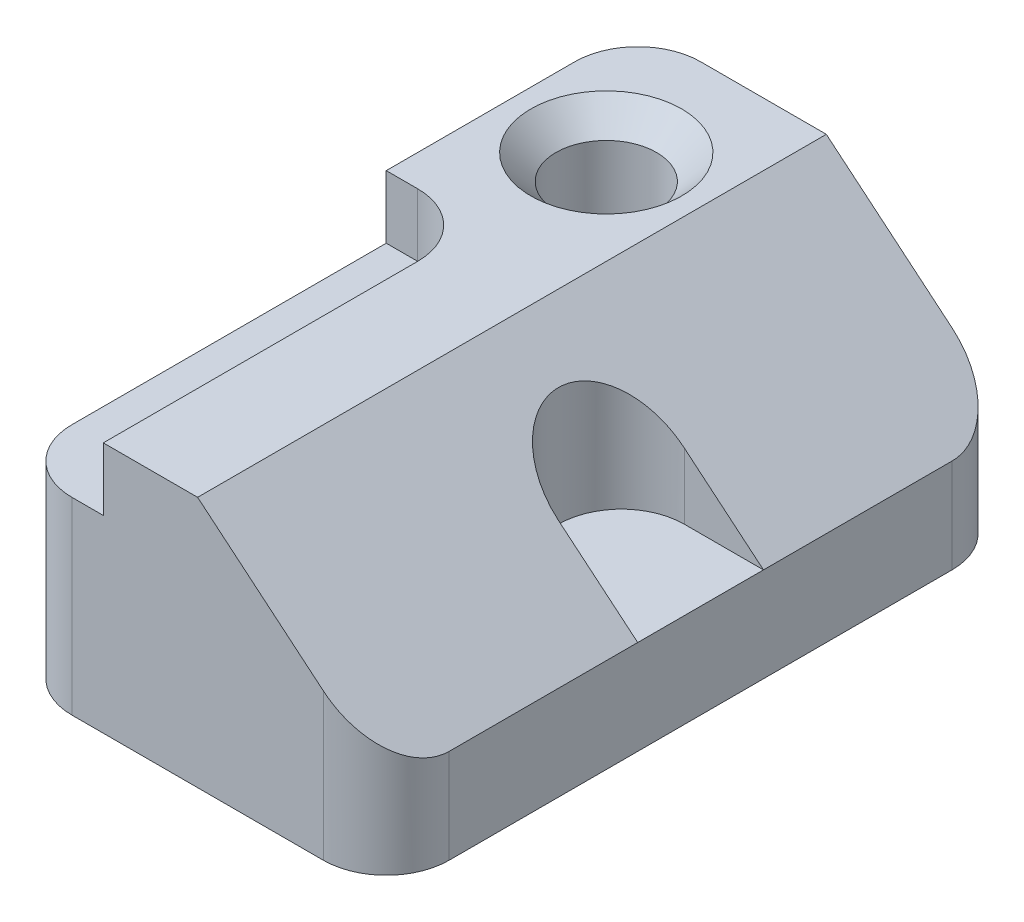
ISO-10303-21;
HEADER;
FILE_DESCRIPTION(('STEP AP214'),'2;1');
FILE_NAME('part.step','',(''),(''),'','','');
FILE_SCHEMA(('AUTOMOTIVE_DESIGN { 1 0 10303 214 1 1 1 1 }'));
ENDSEC;
DATA;
#1=APPLICATION_CONTEXT('core data for automotive mechanical design processes');
#2=APPLICATION_PROTOCOL_DEFINITION('international standard','automotive_design',2000,#1);
#3=PRODUCT_CONTEXT('',#1,'mechanical');
#4=PRODUCT('Part','Part','',(#3));
#5=PRODUCT_RELATED_PRODUCT_CATEGORY('part','',(#4));
#6=PRODUCT_DEFINITION_FORMATION('','',#4);
#7=PRODUCT_DEFINITION_CONTEXT('part definition',#1,'design');
#8=PRODUCT_DEFINITION('design','',#6,#7);
#9=PRODUCT_DEFINITION_SHAPE('','',#8);
#10=(LENGTH_UNIT() NAMED_UNIT(*) SI_UNIT(.MILLI.,.METRE.));
#11=(NAMED_UNIT(*) PLANE_ANGLE_UNIT() SI_UNIT($,.RADIAN.));
#12=(NAMED_UNIT(*) SI_UNIT($,.STERADIAN.) SOLID_ANGLE_UNIT());
#13=UNCERTAINTY_MEASURE_WITH_UNIT(LENGTH_MEASURE(1.E-05),#10,'distance_accuracy_value','');
#14=(GEOMETRIC_REPRESENTATION_CONTEXT(3) GLOBAL_UNCERTAINTY_ASSIGNED_CONTEXT((#13)) GLOBAL_UNIT_ASSIGNED_CONTEXT((#10,
#11,#12)) REPRESENTATION_CONTEXT('',''));
#15=CARTESIAN_POINT('',(0.,0.,0.));
#16=DIRECTION('',(0.,0.,1.));
#17=DIRECTION('',(1.,0.,0.));
#18=AXIS2_PLACEMENT_3D('',#15,#16,#17);
#19=CARTESIAN_POINT('',(0.,50.8,127.));
#20=DIRECTION('',(0.,-1.,0.));
#21=DIRECTION('',(0.,0.,-1.));
#22=AXIS2_PLACEMENT_3D('',#19,#20,#21);
#23=PLANE('',#22);
#24=CARTESIAN_POINT('',(19.0444511670513,50.8,25.4));
#25=DIRECTION('',(0.,-1.,0.));
#26=DIRECTION('',(0.,0.,-1.));
#27=AXIS2_PLACEMENT_3D('',#24,#25,#26);
#28=CIRCLE('',#27,15.24);
#29=CARTESIAN_POINT('',(19.0444511670513,50.8,10.16));
#30=VERTEX_POINT('',#29);
#31=EDGE_CURVE('E231',#30,#30,#28,.T.);
#32=ORIENTED_EDGE('',*,*,#31,.T.);
#33=EDGE_LOOP('',(#32));
#34=FACE_BOUND('',#33,.T.);
#35=DIRECTION('',(-1.,0.,0.));
#36=VECTOR('',#35,1.);
#37=CARTESIAN_POINT('',(0.,50.8,0.));
#38=LINE('',#37,#36);
#39=CARTESIAN_POINT('',(38.1,50.8,0.));
#40=VERTEX_POINT('',#39);
#41=CARTESIAN_POINT('',(12.7,50.8,0.));
#42=VERTEX_POINT('',#41);
#43=EDGE_CURVE('E199',#40,#42,#38,.T.);
#44=ORIENTED_EDGE('',*,*,#43,.T.);
#45=CARTESIAN_POINT('',(12.7,50.8,12.7));
#46=DIRECTION('',(0.,-1.,0.));
#47=DIRECTION('',(0.,0.,-1.));
#48=AXIS2_PLACEMENT_3D('',#45,#46,#47);
#49=CIRCLE('',#48,12.7);
#50=CARTESIAN_POINT('',(0.,50.8,12.7));
#51=VERTEX_POINT('',#50);
#52=EDGE_CURVE('E56',#42,#51,#49,.F.);
#53=ORIENTED_EDGE('',*,*,#52,.T.);
#54=DIRECTION('',(0.,0.,-1.));
#55=VECTOR('',#54,1.);
#56=CARTESIAN_POINT('',(0.,50.8,127.));
#57=LINE('',#56,#55);
#58=CARTESIAN_POINT('',(0.,50.8,50.8));
#59=VERTEX_POINT('',#58);
#60=EDGE_CURVE('E226',#59,#51,#57,.T.);
#61=ORIENTED_EDGE('',*,*,#60,.F.);
#62=DIRECTION('',(-1.,0.,0.));
#63=VECTOR('',#62,1.);
#64=CARTESIAN_POINT('',(0.,50.8,50.8));
#65=LINE('',#64,#63);
#66=CARTESIAN_POINT('',(6.35,50.8,50.8));
#67=VERTEX_POINT('',#66);
#68=EDGE_CURVE('E181',#67,#59,#65,.T.);
#69=ORIENTED_EDGE('',*,*,#68,.F.);
#70=CARTESIAN_POINT('',(6.35,50.8,63.5));
#71=DIRECTION('',(0.,-1.,0.));
#72=DIRECTION('',(0.,0.,-1.));
#73=AXIS2_PLACEMENT_3D('',#70,#71,#72);
#74=CIRCLE('',#73,12.7);
#75=CARTESIAN_POINT('',(19.05,50.8,63.5000000000001));
#76=VERTEX_POINT('',#75);
#77=EDGE_CURVE('E241',#67,#76,#74,.T.);
#78=ORIENTED_EDGE('',*,*,#77,.T.);
#79=DIRECTION('',(0.,0.,-1.));
#80=VECTOR('',#79,1.);
#81=CARTESIAN_POINT('',(19.05,50.8,127.));
#82=LINE('',#81,#80);
#83=CARTESIAN_POINT('',(19.05,50.8,127.));
#84=VERTEX_POINT('',#83);
#85=EDGE_CURVE('E176',#84,#76,#82,.T.);
#86=ORIENTED_EDGE('',*,*,#85,.F.);
#87=DIRECTION('',(-1.,0.,0.));
#88=VECTOR('',#87,1.);
#89=CARTESIAN_POINT('',(0.,50.8,127.));
#90=LINE('',#89,#88);
#91=CARTESIAN_POINT('',(38.1,50.8,127.));
#92=VERTEX_POINT('',#91);
#93=EDGE_CURVE('E200',#92,#84,#90,.T.);
#94=ORIENTED_EDGE('',*,*,#93,.F.);
#95=DIRECTION('',(0.,0.,-1.));
#96=VECTOR('',#95,1.);
#97=CARTESIAN_POINT('',(38.1,50.8,127.));
#98=LINE('',#97,#96);
#99=EDGE_CURVE('E209',#92,#40,#98,.T.);
#100=ORIENTED_EDGE('',*,*,#99,.T.);
#101=EDGE_LOOP('',(#44,#53,#61,#69,#78,#86,#94,#100));
#102=FACE_BOUND('',#101,.T.);
#103=ADVANCED_FACE('F35',(#34,#102),#23,.F.);
#104=CARTESIAN_POINT('',(0.,50.8,127.));
#105=DIRECTION('',(1.,0.,0.));
#106=DIRECTION('',(0.,1.,0.));
#107=AXIS2_PLACEMENT_3D('',#104,#105,#106);
#108=PLANE('',#107);
#109=ORIENTED_EDGE('',*,*,#60,.T.);
#110=DIRECTION('',(0.,-1.,0.));
#111=VECTOR('',#110,1.);
#112=CARTESIAN_POINT('',(0.,50.8,12.7));
#113=LINE('',#112,#111);
#114=CARTESIAN_POINT('',(0.,0.,12.7));
#115=VERTEX_POINT('',#114);
#116=EDGE_CURVE('E272',#51,#115,#113,.T.);
#117=ORIENTED_EDGE('',*,*,#116,.T.);
#118=DIRECTION('',(0.,0.,-1.));
#119=VECTOR('',#118,1.);
#120=CARTESIAN_POINT('',(0.,0.,127.));
#121=LINE('',#120,#119);
#122=CARTESIAN_POINT('',(0.,0.,114.3));
#123=VERTEX_POINT('',#122);
#124=EDGE_CURVE('E223',#123,#115,#121,.T.);
#125=ORIENTED_EDGE('',*,*,#124,.F.);
#126=DIRECTION('',(0.,-1.,0.));
#127=VECTOR('',#126,1.);
#128=CARTESIAN_POINT('',(0.,38.1,114.3));
#129=LINE('',#128,#127);
#130=CARTESIAN_POINT('',(0.,38.1,114.3));
#131=VERTEX_POINT('',#130);
#132=EDGE_CURVE('E270',#123,#131,#129,.F.);
#133=ORIENTED_EDGE('',*,*,#132,.T.);
#134=DIRECTION('',(0.,0.,1.));
#135=VECTOR('',#134,1.);
#136=CARTESIAN_POINT('',(0.,38.1,127.));
#137=LINE('',#136,#135);
#138=CARTESIAN_POINT('',(0.,38.1,50.8));
#139=VERTEX_POINT('',#138);
#140=EDGE_CURVE('E178',#139,#131,#137,.T.);
#141=ORIENTED_EDGE('',*,*,#140,.F.);
#142=DIRECTION('',(0.,1.,0.));
#143=VECTOR('',#142,1.);
#144=CARTESIAN_POINT('',(0.,38.1,50.8));
#145=LINE('',#144,#143);
#146=EDGE_CURVE('E192',#139,#59,#145,.T.);
#147=ORIENTED_EDGE('',*,*,#146,.T.);
#148=EDGE_LOOP('',(#109,#117,#125,#133,#141,#147));
#149=FACE_BOUND('',#148,.T.);
#150=ADVANCED_FACE('F319',(#149),#108,.F.);
#151=CARTESIAN_POINT('',(0.,0.,127.));
#152=DIRECTION('',(0.,1.,0.));
#153=DIRECTION('',(0.,0.,1.));
#154=AXIS2_PLACEMENT_3D('',#151,#152,#153);
#155=PLANE('',#154);
#156=CARTESIAN_POINT('',(19.0444511670513,0.,25.4));
#157=DIRECTION('',(0.,1.,0.));
#158=DIRECTION('',(0.,0.,1.));
#159=AXIS2_PLACEMENT_3D('',#156,#157,#158);
#160=CIRCLE('',#159,10.16);
#161=CARTESIAN_POINT('',(19.0444511670513,0.,35.56));
#162=VERTEX_POINT('',#161);
#163=EDGE_CURVE('E195',#162,#162,#160,.T.);
#164=ORIENTED_EDGE('',*,*,#163,.T.);
#165=EDGE_LOOP('',(#164));
#166=FACE_BOUND('',#165,.T.);
#167=DIRECTION('',(1.,0.,0.));
#168=VECTOR('',#167,1.);
#169=CARTESIAN_POINT('',(0.,0.,0.));
#170=LINE('',#169,#168);
#171=CARTESIAN_POINT('',(12.7,0.,0.));
#172=VERTEX_POINT('',#171);
#173=CARTESIAN_POINT('',(63.5,0.,0.));
#174=VERTEX_POINT('',#173);
#175=EDGE_CURVE('E211',#172,#174,#170,.T.);
#176=ORIENTED_EDGE('',*,*,#175,.T.);
#177=CARTESIAN_POINT('',(63.5,0.,12.7));
#178=DIRECTION('',(0.,1.,0.));
#179=DIRECTION('',(0.,0.,1.));
#180=AXIS2_PLACEMENT_3D('',#177,#178,#179);
#181=CIRCLE('',#180,12.7);
#182=CARTESIAN_POINT('',(76.2,0.,12.7));
#183=VERTEX_POINT('',#182);
#184=EDGE_CURVE('E268',#174,#183,#181,.F.);
#185=ORIENTED_EDGE('',*,*,#184,.T.);
#186=DIRECTION('',(0.,0.,-1.));
#187=VECTOR('',#186,1.);
#188=CARTESIAN_POINT('',(76.2,0.,127.));
#189=LINE('',#188,#187);
#190=CARTESIAN_POINT('',(76.2,0.,114.3));
#191=VERTEX_POINT('',#190);
#192=EDGE_CURVE('E220',#191,#183,#189,.T.);
#193=ORIENTED_EDGE('',*,*,#192,.F.);
#194=CARTESIAN_POINT('',(63.5,0.,114.3));
#195=DIRECTION('',(0.,1.,0.));
#196=DIRECTION('',(0.,0.,1.));
#197=AXIS2_PLACEMENT_3D('',#194,#195,#196);
#198=CIRCLE('',#197,12.7);
#199=CARTESIAN_POINT('',(63.5,0.,127.));
#200=VERTEX_POINT('',#199);
#201=EDGE_CURVE('E262',#191,#200,#198,.F.);
#202=ORIENTED_EDGE('',*,*,#201,.T.);
#203=DIRECTION('',(1.,0.,0.));
#204=VECTOR('',#203,1.);
#205=CARTESIAN_POINT('',(0.,0.,127.));
#206=LINE('',#205,#204);
#207=CARTESIAN_POINT('',(12.7,0.,127.));
#208=VERTEX_POINT('',#207);
#209=EDGE_CURVE('E203',#208,#200,#206,.T.);
#210=ORIENTED_EDGE('',*,*,#209,.F.);
#211=CARTESIAN_POINT('',(12.7,0.,114.3));
#212=DIRECTION('',(0.,1.,0.));
#213=DIRECTION('',(0.,0.,1.));
#214=AXIS2_PLACEMENT_3D('',#211,#212,#213);
#215=CIRCLE('',#214,12.7);
#216=EDGE_CURVE('E264',#208,#123,#215,.F.);
#217=ORIENTED_EDGE('',*,*,#216,.T.);
#218=ORIENTED_EDGE('',*,*,#124,.T.);
#219=CARTESIAN_POINT('',(12.7,0.,12.7));
#220=DIRECTION('',(0.,1.,0.));
#221=DIRECTION('',(0.,0.,1.));
#222=AXIS2_PLACEMENT_3D('',#219,#220,#221);
#223=CIRCLE('',#222,12.7);
#224=EDGE_CURVE('E266',#115,#172,#223,.F.);
#225=ORIENTED_EDGE('',*,*,#224,.T.);
#226=EDGE_LOOP('',(#176,#185,#193,#202,#210,#217,#218,#225));
#227=FACE_BOUND('',#226,.T.);
#228=ADVANCED_FACE('F287',(#166,#227),#155,.F.);
#229=CARTESIAN_POINT('',(76.2,0.,127.));
#230=DIRECTION('',(-1.,0.,0.));
#231=DIRECTION('',(0.,0.,1.));
#232=AXIS2_PLACEMENT_3D('',#229,#230,#231);
#233=PLANE('',#232);
#234=ORIENTED_EDGE('',*,*,#192,.T.);
#235=DIRECTION('',(0.,1.,0.));
#236=VECTOR('',#235,1.);
#237=CARTESIAN_POINT('',(76.2,0.,12.7));
#238=LINE('',#237,#236);
#239=CARTESIAN_POINT('',(76.2,19.05,12.7));
#240=VERTEX_POINT('',#239);
#241=EDGE_CURVE('E251',#183,#240,#238,.T.);
#242=ORIENTED_EDGE('',*,*,#241,.T.);
#243=DIRECTION('',(0.,0.,-1.));
#244=VECTOR('',#243,1.);
#245=CARTESIAN_POINT('',(76.2,19.05,127.));
#246=LINE('',#245,#244);
#247=CARTESIAN_POINT('',(76.2,19.05,50.8));
#248=VERTEX_POINT('',#247);
#249=EDGE_CURVE('E217',#248,#240,#246,.T.);
#250=ORIENTED_EDGE('',*,*,#249,.F.);
#251=DIRECTION('',(0.,0.,1.));
#252=VECTOR('',#251,1.);
#253=CARTESIAN_POINT('',(76.2,19.05,50.8));
#254=LINE('',#253,#252);
#255=CARTESIAN_POINT('',(76.2,19.05,76.2));
#256=VERTEX_POINT('',#255);
#257=EDGE_CURVE('E159',#248,#256,#254,.T.);
#258=ORIENTED_EDGE('',*,*,#257,.T.);
#259=CARTESIAN_POINT('',(76.2,19.05,114.3));
#260=VERTEX_POINT('',#259);
#261=EDGE_CURVE('E218',#260,#256,#246,.T.);
#262=ORIENTED_EDGE('',*,*,#261,.F.);
#263=DIRECTION('',(0.,1.,0.));
#264=VECTOR('',#263,1.);
#265=CARTESIAN_POINT('',(76.2,0.,114.3));
#266=LINE('',#265,#264);
#267=EDGE_CURVE('E249',#260,#191,#266,.F.);
#268=ORIENTED_EDGE('',*,*,#267,.T.);
#269=EDGE_LOOP('',(#234,#242,#250,#258,#262,#268));
#270=FACE_BOUND('',#269,.T.);
#271=ADVANCED_FACE('F333',(#270),#233,.F.);
#272=CARTESIAN_POINT('',(76.2,19.05,127.));
#273=DIRECTION('',(-0.64018439966448,-0.768221279597376,0.));
#274=DIRECTION('',(0.768221279597376,-0.64018439966448,0.));
#275=AXIS2_PLACEMENT_3D('',#272,#273,#274);
#276=PLANE('',#275);
#277=ORIENTED_EDGE('',*,*,#249,.T.);
#278=CARTESIAN_POINT('',(63.5,29.6333333333333,12.7));
#279=DIRECTION('',(-0.64018439966448,-0.768221279597376,0.));
#280=DIRECTION('',(-0.768221279597376,0.64018439966448,0.));
#281=AXIS2_PLACEMENT_3D('',#278,#279,#280);
#282=ELLIPSE('',#281,16.5316951473357,12.7);
#283=CARTESIAN_POINT('',(63.5,29.6333333333333,0.));
#284=VERTEX_POINT('',#283);
#285=EDGE_CURVE('E256',#240,#284,#282,.F.);
#286=ORIENTED_EDGE('',*,*,#285,.T.);
#287=DIRECTION('',(-0.768221279597376,0.64018439966448,0.));
#288=VECTOR('',#287,1.);
#289=CARTESIAN_POINT('',(76.2,19.05,0.));
#290=LINE('',#289,#288);
#291=EDGE_CURVE('E204',#284,#40,#290,.T.);
#292=ORIENTED_EDGE('',*,*,#291,.T.);
#293=ORIENTED_EDGE('',*,*,#99,.F.);
#294=DIRECTION('',(-0.768221279597376,0.64018439966448,0.));
#295=VECTOR('',#294,1.);
#296=CARTESIAN_POINT('',(76.2,19.05,127.));
#297=LINE('',#296,#295);
#298=CARTESIAN_POINT('',(63.5,29.6333333333333,127.));
#299=VERTEX_POINT('',#298);
#300=EDGE_CURVE('E207',#299,#92,#297,.T.);
#301=ORIENTED_EDGE('',*,*,#300,.F.);
#302=CARTESIAN_POINT('',(63.5,29.6333333333333,114.3));
#303=DIRECTION('',(-0.64018439966448,-0.768221279597376,0.));
#304=DIRECTION('',(0.768221279597376,-0.64018439966448,0.));
#305=AXIS2_PLACEMENT_3D('',#302,#303,#304);
#306=ELLIPSE('',#305,16.5316951473357,12.7);
#307=EDGE_CURVE('E254',#299,#260,#306,.F.);
#308=ORIENTED_EDGE('',*,*,#307,.T.);
#309=ORIENTED_EDGE('',*,*,#261,.T.);
#310=DIRECTION('',(-0.768221279597376,0.64018439966448,0.));
#311=VECTOR('',#310,1.);
#312=CARTESIAN_POINT('',(76.2,19.05,76.2));
#313=LINE('',#312,#311);
#314=CARTESIAN_POINT('',(60.198,32.385,76.2));
#315=VERTEX_POINT('',#314);
#316=EDGE_CURVE('E245',#256,#315,#313,.T.);
#317=ORIENTED_EDGE('',*,*,#316,.T.);
#318=CARTESIAN_POINT('',(60.198,32.385,63.5));
#319=DIRECTION('',(-0.64018439966448,-0.768221279597376,0.));
#320=DIRECTION('',(-0.768221279597376,0.64018439966448,0.));
#321=AXIS2_PLACEMENT_3D('',#318,#319,#320);
#322=ELLIPSE('',#321,16.5316951473357,12.7);
#323=CARTESIAN_POINT('',(60.198,32.385,50.8));
#324=VERTEX_POINT('',#323);
#325=EDGE_CURVE('E243',#315,#324,#322,.T.);
#326=ORIENTED_EDGE('',*,*,#325,.T.);
#327=DIRECTION('',(0.768221279597376,-0.64018439966448,0.));
#328=VECTOR('',#327,1.);
#329=CARTESIAN_POINT('',(76.2,19.05,50.8));
#330=LINE('',#329,#328);
#331=EDGE_CURVE('E155',#324,#248,#330,.T.);
#332=ORIENTED_EDGE('',*,*,#331,.T.);
#333=EDGE_LOOP('',(#277,#286,#292,#293,#301,#308,#309,#317,#326,#332));
#334=FACE_BOUND('',#333,.T.);
#335=ADVANCED_FACE('F297',(#334),#276,.F.);
#336=CARTESIAN_POINT('',(0.,0.,127.));
#337=DIRECTION('',(0.,0.,1.));
#338=DIRECTION('',(1.,0.,0.));
#339=AXIS2_PLACEMENT_3D('',#336,#337,#338);
#340=PLANE('',#339);
#341=DIRECTION('',(1.,0.,0.));
#342=VECTOR('',#341,1.);
#343=CARTESIAN_POINT('',(0.,38.1,127.));
#344=LINE('',#343,#342);
#345=CARTESIAN_POINT('',(12.7,38.1,127.));
#346=VERTEX_POINT('',#345);
#347=CARTESIAN_POINT('',(19.05,38.1,127.));
#348=VERTEX_POINT('',#347);
#349=EDGE_CURVE('E180',#346,#348,#344,.T.);
#350=ORIENTED_EDGE('',*,*,#349,.F.);
#351=DIRECTION('',(0.,-1.,0.));
#352=VECTOR('',#351,1.);
#353=CARTESIAN_POINT('',(12.7,0.,127.));
#354=LINE('',#353,#352);
#355=EDGE_CURVE('E43',#346,#208,#354,.T.);
#356=ORIENTED_EDGE('',*,*,#355,.T.);
#357=ORIENTED_EDGE('',*,*,#209,.T.);
#358=DIRECTION('',(0.,1.,0.));
#359=VECTOR('',#358,1.);
#360=CARTESIAN_POINT('',(63.5,19.05,127.));
#361=LINE('',#360,#359);
#362=EDGE_CURVE('E276',#200,#299,#361,.T.);
#363=ORIENTED_EDGE('',*,*,#362,.T.);
#364=ORIENTED_EDGE('',*,*,#300,.T.);
#365=ORIENTED_EDGE('',*,*,#93,.T.);
#366=DIRECTION('',(0.,1.,0.));
#367=VECTOR('',#366,1.);
#368=CARTESIAN_POINT('',(19.05,38.1,127.));
#369=LINE('',#368,#367);
#370=EDGE_CURVE('E188',#348,#84,#369,.T.);
#371=ORIENTED_EDGE('',*,*,#370,.F.);
#372=EDGE_LOOP('',(#350,#356,#357,#363,#364,#365,#371));
#373=FACE_BOUND('',#372,.T.);
#374=ADVANCED_FACE('F282',(#373),#340,.T.);
#375=CARTESIAN_POINT('',(0.,0.,0.));
#376=DIRECTION('',(0.,0.,1.));
#377=DIRECTION('',(1.,0.,0.));
#378=AXIS2_PLACEMENT_3D('',#375,#376,#377);
#379=PLANE('',#378);
#380=ORIENTED_EDGE('',*,*,#291,.F.);
#381=DIRECTION('',(0.,1.,0.));
#382=VECTOR('',#381,1.);
#383=CARTESIAN_POINT('',(63.5,0.,0.));
#384=LINE('',#383,#382);
#385=EDGE_CURVE('E260',#284,#174,#384,.F.);
#386=ORIENTED_EDGE('',*,*,#385,.T.);
#387=ORIENTED_EDGE('',*,*,#175,.F.);
#388=DIRECTION('',(0.,-1.,0.));
#389=VECTOR('',#388,1.);
#390=CARTESIAN_POINT('',(12.7,0.,0.));
#391=LINE('',#390,#389);
#392=EDGE_CURVE('E258',#172,#42,#391,.F.);
#393=ORIENTED_EDGE('',*,*,#392,.T.);
#394=ORIENTED_EDGE('',*,*,#43,.F.);
#395=EDGE_LOOP('',(#380,#386,#387,#393,#394));
#396=FACE_BOUND('',#395,.T.);
#397=ADVANCED_FACE('F327',(#396),#379,.F.);
#398=CARTESIAN_POINT('',(19.0444511670513,0.,25.4));
#399=DIRECTION('',(0.,1.,0.));
#400=DIRECTION('',(0.,0.,1.));
#401=AXIS2_PLACEMENT_3D('',#398,#399,#400);
#402=CYLINDRICAL_SURFACE('',#401,10.16);
#403=CARTESIAN_POINT('',(19.0444511670513,45.72,25.4));
#404=DIRECTION('',(0.,-1.,0.));
#405=DIRECTION('',(0.,0.,-1.));
#406=AXIS2_PLACEMENT_3D('',#403,#404,#405);
#407=CIRCLE('',#406,10.16);
#408=CARTESIAN_POINT('',(19.0444511670513,45.72,15.24));
#409=VERTEX_POINT('',#408);
#410=EDGE_CURVE('E228',#409,#409,#407,.F.);
#411=ORIENTED_EDGE('',*,*,#410,.T.);
#412=EDGE_LOOP('',(#411));
#413=FACE_BOUND('',#412,.T.);
#414=ORIENTED_EDGE('',*,*,#163,.F.);
#415=EDGE_LOOP('',(#414));
#416=FACE_BOUND('',#415,.T.);
#417=ADVANCED_FACE('F362',(#413,#416),#402,.F.);
#418=CARTESIAN_POINT('',(19.0444511670513,45.72,25.4));
#419=DIRECTION('',(0.,1.,0.));
#420=DIRECTION('',(0.,0.,1.));
#421=AXIS2_PLACEMENT_3D('',#418,#419,#420);
#422=CONICAL_SURFACE('',#421,10.16,0.785398163397449);
#423=ORIENTED_EDGE('',*,*,#31,.F.);
#424=EDGE_LOOP('',(#423));
#425=FACE_BOUND('',#424,.T.);
#426=ORIENTED_EDGE('',*,*,#410,.F.);
#427=EDGE_LOOP('',(#426));
#428=FACE_BOUND('',#427,.T.);
#429=ADVANCED_FACE('F357',(#425,#428),#422,.F.);
#430=CARTESIAN_POINT('',(0.,38.1,50.8));
#431=DIRECTION('',(0.,0.,-1.));
#432=DIRECTION('',(-1.,0.,0.));
#433=AXIS2_PLACEMENT_3D('',#430,#431,#432);
#434=PLANE('',#433);
#435=DIRECTION('',(-1.,0.,0.));
#436=VECTOR('',#435,1.);
#437=CARTESIAN_POINT('',(0.,38.1,50.8));
#438=LINE('',#437,#436);
#439=CARTESIAN_POINT('',(6.35,38.1,50.8));
#440=VERTEX_POINT('',#439);
#441=EDGE_CURVE('E186',#440,#139,#438,.T.);
#442=ORIENTED_EDGE('',*,*,#441,.F.);
#443=DIRECTION('',(0.,1.,0.));
#444=VECTOR('',#443,1.);
#445=CARTESIAN_POINT('',(6.35,50.8,50.8));
#446=LINE('',#445,#444);
#447=EDGE_CURVE('E234',#440,#67,#446,.T.);
#448=ORIENTED_EDGE('',*,*,#447,.T.);
#449=ORIENTED_EDGE('',*,*,#68,.T.);
#450=ORIENTED_EDGE('',*,*,#146,.F.);
#451=EDGE_LOOP('',(#442,#448,#449,#450));
#452=FACE_BOUND('',#451,.T.);
#453=ADVANCED_FACE('F315',(#452),#434,.F.);
#454=CARTESIAN_POINT('',(19.05,38.1,127.));
#455=DIRECTION('',(1.,0.,0.));
#456=DIRECTION('',(0.,0.,-1.));
#457=AXIS2_PLACEMENT_3D('',#454,#455,#456);
#458=PLANE('',#457);
#459=ORIENTED_EDGE('',*,*,#85,.T.);
#460=DIRECTION('',(0.,1.,0.));
#461=VECTOR('',#460,1.);
#462=CARTESIAN_POINT('',(19.05,38.1,63.5));
#463=LINE('',#462,#461);
#464=CARTESIAN_POINT('',(19.05,38.1,63.5000000000001));
#465=VERTEX_POINT('',#464);
#466=EDGE_CURVE('E237',#76,#465,#463,.F.);
#467=ORIENTED_EDGE('',*,*,#466,.T.);
#468=DIRECTION('',(0.,0.,-1.));
#469=VECTOR('',#468,1.);
#470=CARTESIAN_POINT('',(19.05,38.1,127.));
#471=LINE('',#470,#469);
#472=EDGE_CURVE('E183',#348,#465,#471,.T.);
#473=ORIENTED_EDGE('',*,*,#472,.F.);
#474=ORIENTED_EDGE('',*,*,#370,.T.);
#475=EDGE_LOOP('',(#459,#467,#473,#474));
#476=FACE_BOUND('',#475,.T.);
#477=ADVANCED_FACE('F305',(#476),#458,.F.);
#478=CARTESIAN_POINT('',(0.,38.1,0.));
#479=DIRECTION('',(0.,-1.,0.));
#480=DIRECTION('',(0.,0.,-1.));
#481=AXIS2_PLACEMENT_3D('',#478,#479,#480);
#482=PLANE('',#481);
#483=ORIENTED_EDGE('',*,*,#140,.T.);
#484=CARTESIAN_POINT('',(12.7,38.1,114.3));
#485=DIRECTION('',(0.,-1.,0.));
#486=DIRECTION('',(0.,0.,-1.));
#487=AXIS2_PLACEMENT_3D('',#484,#485,#486);
#488=CIRCLE('',#487,12.7);
#489=EDGE_CURVE('E11',#131,#346,#488,.F.);
#490=ORIENTED_EDGE('',*,*,#489,.T.);
#491=ORIENTED_EDGE('',*,*,#349,.T.);
#492=ORIENTED_EDGE('',*,*,#472,.T.);
#493=CARTESIAN_POINT('',(6.35,38.1,63.5));
#494=DIRECTION('',(0.,-1.,0.));
#495=DIRECTION('',(0.,0.,-1.));
#496=AXIS2_PLACEMENT_3D('',#493,#494,#495);
#497=CIRCLE('',#496,12.7);
#498=EDGE_CURVE('E239',#465,#440,#497,.F.);
#499=ORIENTED_EDGE('',*,*,#498,.T.);
#500=ORIENTED_EDGE('',*,*,#441,.T.);
#501=EDGE_LOOP('',(#483,#490,#491,#492,#499,#500));
#502=FACE_BOUND('',#501,.T.);
#503=ADVANCED_FACE('F308',(#502),#482,.F.);
#504=CARTESIAN_POINT('',(6.35,38.1,63.5));
#505=DIRECTION('',(0.,-1.,0.));
#506=DIRECTION('',(0.,0.,-1.));
#507=AXIS2_PLACEMENT_3D('',#504,#505,#506);
#508=CYLINDRICAL_SURFACE('',#507,12.7);
#509=ORIENTED_EDGE('',*,*,#498,.F.);
#510=ORIENTED_EDGE('',*,*,#466,.F.);
#511=ORIENTED_EDGE('',*,*,#77,.F.);
#512=ORIENTED_EDGE('',*,*,#447,.F.);
#513=EDGE_LOOP('',(#509,#510,#511,#512));
#514=FACE_BOUND('',#513,.T.);
#515=ADVANCED_FACE('F312',(#514),#508,.F.);
#516=CARTESIAN_POINT('',(76.2,19.05,50.8));
#517=DIRECTION('',(0.,0.,-1.));
#518=DIRECTION('',(-1.,0.,0.));
#519=AXIS2_PLACEMENT_3D('',#516,#517,#518);
#520=PLANE('',#519);
#521=DIRECTION('',(0.,1.,0.));
#522=VECTOR('',#521,1.);
#523=CARTESIAN_POINT('',(60.198,19.05,50.8));
#524=LINE('',#523,#522);
#525=CARTESIAN_POINT('',(60.198,19.05,50.8));
#526=VERTEX_POINT('',#525);
#527=EDGE_CURVE('E149',#526,#324,#524,.T.);
#528=ORIENTED_EDGE('',*,*,#527,.F.);
#529=DIRECTION('',(-1.,0.,0.));
#530=VECTOR('',#529,1.);
#531=CARTESIAN_POINT('',(76.2,19.05,50.8));
#532=LINE('',#531,#530);
#533=EDGE_CURVE('E153',#248,#526,#532,.T.);
#534=ORIENTED_EDGE('',*,*,#533,.F.);
#535=ORIENTED_EDGE('',*,*,#331,.F.);
#536=EDGE_LOOP('',(#528,#534,#535));
#537=FACE_BOUND('',#536,.T.);
#538=ADVANCED_FACE('F151',(#537),#520,.F.);
#539=CARTESIAN_POINT('',(60.198,19.05,76.2));
#540=DIRECTION('',(0.,0.,1.));
#541=DIRECTION('',(1.,0.,0.));
#542=AXIS2_PLACEMENT_3D('',#539,#540,#541);
#543=PLANE('',#542);
#544=DIRECTION('',(1.,0.,0.));
#545=VECTOR('',#544,1.);
#546=CARTESIAN_POINT('',(60.198,19.05,76.2));
#547=LINE('',#546,#545);
#548=CARTESIAN_POINT('',(60.198,19.05,76.2));
#549=VERTEX_POINT('',#548);
#550=EDGE_CURVE('E168',#549,#256,#547,.T.);
#551=ORIENTED_EDGE('',*,*,#550,.F.);
#552=DIRECTION('',(0.,1.,0.));
#553=VECTOR('',#552,1.);
#554=CARTESIAN_POINT('',(60.198,19.05,76.2));
#555=LINE('',#554,#553);
#556=EDGE_CURVE('E158',#549,#315,#555,.T.);
#557=ORIENTED_EDGE('',*,*,#556,.T.);
#558=ORIENTED_EDGE('',*,*,#316,.F.);
#559=EDGE_LOOP('',(#551,#557,#558));
#560=FACE_BOUND('',#559,.T.);
#561=ADVANCED_FACE('F337',(#560),#543,.F.);
#562=CARTESIAN_POINT('',(60.198,19.05,63.5));
#563=DIRECTION('',(0.,1.,0.));
#564=DIRECTION('',(0.,0.,1.));
#565=AXIS2_PLACEMENT_3D('',#562,#563,#564);
#566=CYLINDRICAL_SURFACE('',#565,12.7);
#567=ORIENTED_EDGE('',*,*,#556,.F.);
#568=CARTESIAN_POINT('',(60.198,19.05,63.5));
#569=DIRECTION('',(0.,1.,0.));
#570=DIRECTION('',(0.,0.,1.));
#571=AXIS2_PLACEMENT_3D('',#568,#569,#570);
#572=CIRCLE('',#571,12.7);
#573=EDGE_CURVE('E162',#526,#549,#572,.T.);
#574=ORIENTED_EDGE('',*,*,#573,.F.);
#575=ORIENTED_EDGE('',*,*,#527,.T.);
#576=ORIENTED_EDGE('',*,*,#325,.F.);
#577=EDGE_LOOP('',(#567,#574,#575,#576));
#578=FACE_BOUND('',#577,.T.);
#579=ADVANCED_FACE('F163',(#578),#566,.F.);
#580=CARTESIAN_POINT('',(60.198,19.05,63.5));
#581=DIRECTION('',(0.,1.,0.));
#582=DIRECTION('',(0.,0.,1.));
#583=AXIS2_PLACEMENT_3D('',#580,#581,#582);
#584=PLANE('',#583);
#585=ORIENTED_EDGE('',*,*,#533,.T.);
#586=ORIENTED_EDGE('',*,*,#573,.T.);
#587=ORIENTED_EDGE('',*,*,#550,.T.);
#588=ORIENTED_EDGE('',*,*,#257,.F.);
#589=EDGE_LOOP('',(#585,#586,#587,#588));
#590=FACE_BOUND('',#589,.T.);
#591=ADVANCED_FACE('F170',(#590),#584,.T.);
#592=CARTESIAN_POINT('',(63.5,0.,12.7));
#593=DIRECTION('',(0.,1.,0.));
#594=DIRECTION('',(0.,0.,1.));
#595=AXIS2_PLACEMENT_3D('',#592,#593,#594);
#596=CYLINDRICAL_SURFACE('',#595,12.7);
#597=ORIENTED_EDGE('',*,*,#184,.F.);
#598=ORIENTED_EDGE('',*,*,#385,.F.);
#599=ORIENTED_EDGE('',*,*,#285,.F.);
#600=ORIENTED_EDGE('',*,*,#241,.F.);
#601=EDGE_LOOP('',(#597,#598,#599,#600));
#602=FACE_BOUND('',#601,.T.);
#603=ADVANCED_FACE('F330',(#602),#596,.T.);
#604=CARTESIAN_POINT('',(12.7,50.8,12.7));
#605=DIRECTION('',(0.,-1.,0.));
#606=DIRECTION('',(1.,0.,0.));
#607=AXIS2_PLACEMENT_3D('',#604,#605,#606);
#608=CYLINDRICAL_SURFACE('',#607,12.7);
#609=ORIENTED_EDGE('',*,*,#52,.F.);
#610=ORIENTED_EDGE('',*,*,#392,.F.);
#611=ORIENTED_EDGE('',*,*,#224,.F.);
#612=ORIENTED_EDGE('',*,*,#116,.F.);
#613=EDGE_LOOP('',(#609,#610,#611,#612));
#614=FACE_BOUND('',#613,.T.);
#615=ADVANCED_FACE('F322',(#614),#608,.T.);
#616=CARTESIAN_POINT('',(12.7,0.,114.3));
#617=DIRECTION('',(0.,1.,0.));
#618=DIRECTION('',(-1.,0.,0.));
#619=AXIS2_PLACEMENT_3D('',#616,#617,#618);
#620=CYLINDRICAL_SURFACE('',#619,12.7);
#621=ORIENTED_EDGE('',*,*,#489,.F.);
#622=ORIENTED_EDGE('',*,*,#132,.F.);
#623=ORIENTED_EDGE('',*,*,#216,.F.);
#624=ORIENTED_EDGE('',*,*,#355,.F.);
#625=EDGE_LOOP('',(#621,#622,#623,#624));
#626=FACE_BOUND('',#625,.T.);
#627=ADVANCED_FACE('F369',(#626),#620,.T.);
#628=CARTESIAN_POINT('',(63.5,0.,114.3));
#629=DIRECTION('',(0.,-1.,0.));
#630=DIRECTION('',(0.,0.,-1.));
#631=AXIS2_PLACEMENT_3D('',#628,#629,#630);
#632=CYLINDRICAL_SURFACE('',#631,12.7);
#633=ORIENTED_EDGE('',*,*,#201,.F.);
#634=ORIENTED_EDGE('',*,*,#267,.F.);
#635=ORIENTED_EDGE('',*,*,#307,.F.);
#636=ORIENTED_EDGE('',*,*,#362,.F.);
#637=EDGE_LOOP('',(#633,#634,#635,#636));
#638=FACE_BOUND('',#637,.T.);
#639=ADVANCED_FACE('F37',(#638),#632,.T.);
#640=CLOSED_SHELL('',(#103,#150,#228,#271,#335,#374,#397,#417,#429,#453,#477,#503,#515,#538,
#561,#579,#591,#603,#615,#627,#639));
#641=MANIFOLD_SOLID_BREP('B2',#640);
#642=ADVANCED_BREP_SHAPE_REPRESENTATION('',(#18,#641),#14);
#643=SHAPE_DEFINITION_REPRESENTATION(#9,#642);
ENDSEC;
END-ISO-10303-21;
